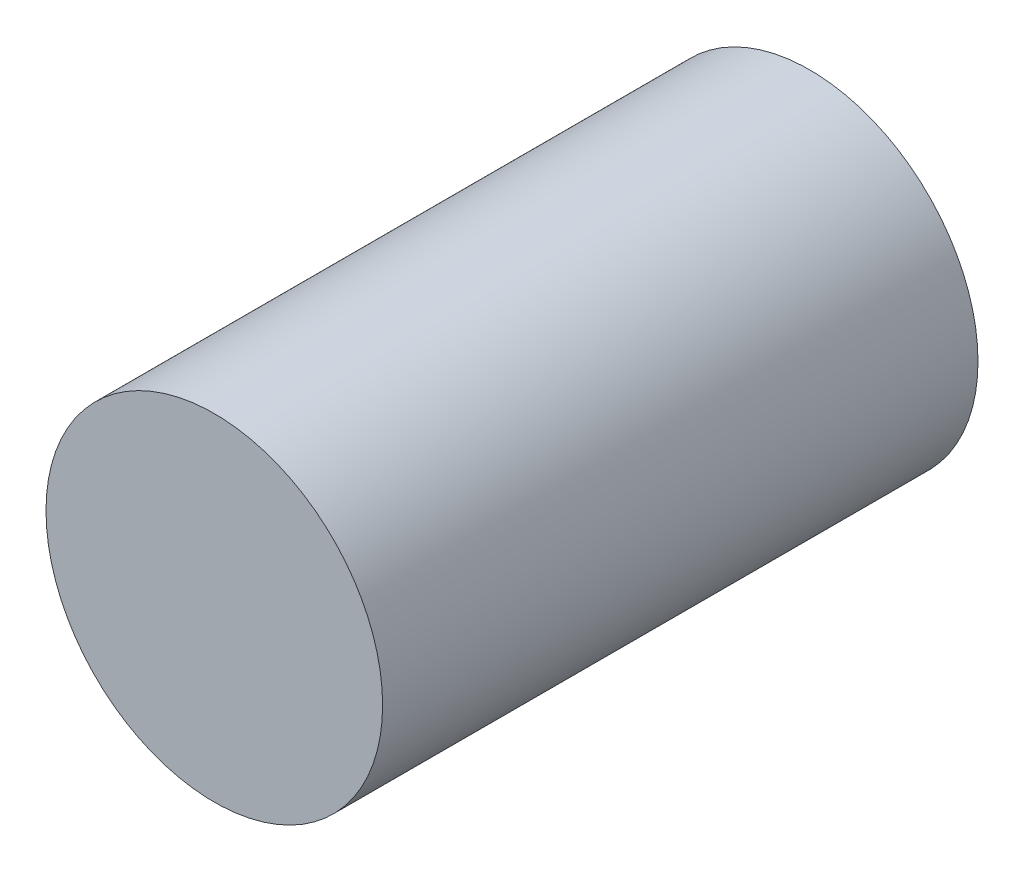
ISO-10303-21;
HEADER;
FILE_DESCRIPTION(('STEP AP214'),'2;1');
FILE_NAME('part.step','',(''),(''),'','','');
FILE_SCHEMA(('AUTOMOTIVE_DESIGN { 1 0 10303 214 1 1 1 1 }'));
ENDSEC;
DATA;
#1=APPLICATION_CONTEXT('core data for automotive mechanical design processes');
#2=APPLICATION_PROTOCOL_DEFINITION('international standard','automotive_design',2000,#1);
#3=PRODUCT_CONTEXT('',#1,'mechanical');
#4=PRODUCT('Part','Part','',(#3));
#5=PRODUCT_RELATED_PRODUCT_CATEGORY('part','',(#4));
#6=PRODUCT_DEFINITION_FORMATION('','',#4);
#7=PRODUCT_DEFINITION_CONTEXT('part definition',#1,'design');
#8=PRODUCT_DEFINITION('design','',#6,#7);
#9=PRODUCT_DEFINITION_SHAPE('','',#8);
#10=(LENGTH_UNIT() NAMED_UNIT(*) SI_UNIT(.MILLI.,.METRE.));
#11=(NAMED_UNIT(*) PLANE_ANGLE_UNIT() SI_UNIT($,.RADIAN.));
#12=(NAMED_UNIT(*) SI_UNIT($,.STERADIAN.) SOLID_ANGLE_UNIT());
#13=UNCERTAINTY_MEASURE_WITH_UNIT(LENGTH_MEASURE(1.E-05),#10,'distance_accuracy_value','');
#14=(GEOMETRIC_REPRESENTATION_CONTEXT(3) GLOBAL_UNCERTAINTY_ASSIGNED_CONTEXT((#13)) GLOBAL_UNIT_ASSIGNED_CONTEXT((#10,
#11,#12)) REPRESENTATION_CONTEXT('',''));
#15=CARTESIAN_POINT('',(0.,0.,0.));
#16=DIRECTION('',(0.,0.,1.));
#17=DIRECTION('',(1.,0.,0.));
#18=AXIS2_PLACEMENT_3D('',#15,#16,#17);
#19=CARTESIAN_POINT('',(0.,0.,116.74));
#20=DIRECTION('',(0.,0.,-1.));
#21=DIRECTION('',(-1.,0.,0.));
#22=AXIS2_PLACEMENT_3D('',#19,#20,#21);
#23=CYLINDRICAL_SURFACE('',#22,33.);
#24=CARTESIAN_POINT('',(0.,0.,116.74));
#25=DIRECTION('',(0.,0.,1.));
#26=DIRECTION('',(1.,0.,0.));
#27=AXIS2_PLACEMENT_3D('',#24,#25,#26);
#28=CIRCLE('',#27,33.);
#29=CARTESIAN_POINT('',(-33.,0.,116.74));
#30=VERTEX_POINT('',#29);
#31=EDGE_CURVE('E10',#30,#30,#28,.T.);
#32=CARTESIAN_POINT('',(0.,0.,0.));
#33=DIRECTION('',(0.,0.,1.));
#34=DIRECTION('',(1.,0.,0.));
#35=AXIS2_PLACEMENT_3D('',#32,#33,#34);
#36=CIRCLE('',#35,33.);
#37=CARTESIAN_POINT('',(-33.,0.,0.));
#38=VERTEX_POINT('',#37);
#39=EDGE_CURVE('E37',#38,#38,#36,.T.);
#40=CARTESIAN_POINT('',(-33.,0.,116.74));
#41=CARTESIAN_POINT('',(-33.,0.,115.523958333333));
#42=CARTESIAN_POINT('',(-33.,0.,114.307916666667));
#43=CARTESIAN_POINT('',(-33.,0.,111.875833333333));
#44=CARTESIAN_POINT('',(-33.,0.,110.659791666667));
#45=CARTESIAN_POINT('',(-33.,0.,108.227708333333));
#46=CARTESIAN_POINT('',(-33.,0.,107.011666666667));
#47=CARTESIAN_POINT('',(-33.,0.,104.579583333333));
#48=CARTESIAN_POINT('',(-33.,0.,103.363541666667));
#49=CARTESIAN_POINT('',(-33.,0.,100.931458333333));
#50=CARTESIAN_POINT('',(-33.,0.,99.7154166666667));
#51=CARTESIAN_POINT('',(-33.,0.,97.2833333333333));
#52=CARTESIAN_POINT('',(-33.,0.,96.0672916666667));
#53=CARTESIAN_POINT('',(-33.,0.,93.6352083333333));
#54=CARTESIAN_POINT('',(-33.,0.,92.4191666666667));
#55=CARTESIAN_POINT('',(-33.,0.,89.9870833333333));
#56=CARTESIAN_POINT('',(-33.,0.,88.7710416666667));
#57=CARTESIAN_POINT('',(-33.,0.,86.3389583333333));
#58=CARTESIAN_POINT('',(-33.,0.,85.1229166666667));
#59=CARTESIAN_POINT('',(-33.,0.,82.6908333333333));
#60=CARTESIAN_POINT('',(-33.,0.,81.4747916666667));
#61=CARTESIAN_POINT('',(-33.,0.,79.0427083333333));
#62=CARTESIAN_POINT('',(-33.,0.,77.8266666666667));
#63=CARTESIAN_POINT('',(-33.,0.,75.3945833333333));
#64=CARTESIAN_POINT('',(-33.,0.,74.1785416666667));
#65=CARTESIAN_POINT('',(-33.,0.,71.7464583333333));
#66=CARTESIAN_POINT('',(-33.,0.,70.5304166666667));
#67=CARTESIAN_POINT('',(-33.,0.,68.0983333333333));
#68=CARTESIAN_POINT('',(-33.,0.,66.8822916666667));
#69=CARTESIAN_POINT('',(-33.,0.,64.4502083333333));
#70=CARTESIAN_POINT('',(-33.,0.,63.2341666666667));
#71=CARTESIAN_POINT('',(-33.,0.,60.8020833333333));
#72=CARTESIAN_POINT('',(-33.,0.,59.5860416666667));
#73=CARTESIAN_POINT('',(-33.,0.,57.1539583333333));
#74=CARTESIAN_POINT('',(-33.,0.,55.9379166666667));
#75=CARTESIAN_POINT('',(-33.,0.,53.5058333333333));
#76=CARTESIAN_POINT('',(-33.,0.,52.2897916666667));
#77=CARTESIAN_POINT('',(-33.,0.,49.8577083333333));
#78=CARTESIAN_POINT('',(-33.,0.,48.6416666666667));
#79=CARTESIAN_POINT('',(-33.,0.,46.2095833333333));
#80=CARTESIAN_POINT('',(-33.,0.,44.9935416666667));
#81=CARTESIAN_POINT('',(-33.,0.,42.5614583333333));
#82=CARTESIAN_POINT('',(-33.,0.,41.3454166666667));
#83=CARTESIAN_POINT('',(-33.,0.,38.9133333333333));
#84=CARTESIAN_POINT('',(-33.,0.,37.6972916666667));
#85=CARTESIAN_POINT('',(-33.,0.,35.2652083333333));
#86=CARTESIAN_POINT('',(-33.,0.,34.0491666666667));
#87=CARTESIAN_POINT('',(-33.,0.,31.6170833333333));
#88=CARTESIAN_POINT('',(-33.,0.,30.4010416666667));
#89=CARTESIAN_POINT('',(-33.,0.,27.9689583333333));
#90=CARTESIAN_POINT('',(-33.,0.,26.7529166666667));
#91=CARTESIAN_POINT('',(-33.,0.,24.3208333333333));
#92=CARTESIAN_POINT('',(-33.,0.,23.1047916666667));
#93=CARTESIAN_POINT('',(-33.,0.,20.6727083333333));
#94=CARTESIAN_POINT('',(-33.,0.,19.4566666666667));
#95=CARTESIAN_POINT('',(-33.,0.,17.0245833333333));
#96=CARTESIAN_POINT('',(-33.,0.,15.8085416666667));
#97=CARTESIAN_POINT('',(-33.,0.,13.3764583333333));
#98=CARTESIAN_POINT('',(-33.,0.,12.1604166666667));
#99=CARTESIAN_POINT('',(-33.,0.,9.72833333333334));
#100=CARTESIAN_POINT('',(-33.,0.,8.51229166666667));
#101=CARTESIAN_POINT('',(-33.,0.,6.08020833333334));
#102=CARTESIAN_POINT('',(-33.,0.,4.86416666666667));
#103=CARTESIAN_POINT('',(-33.,0.,2.43208333333333));
#104=CARTESIAN_POINT('',(-33.,0.,1.21604166666667));
#105=CARTESIAN_POINT('',(-33.,0.,0.));
#106=B_SPLINE_CURVE_WITH_KNOTS('',3,(#40,#41,#42,#43,#44,#45,#46,#47,#48,#49,#50,#51,#52,#53,
#54,#55,#56,#57,#58,#59,#60,#61,#62,#63,#64,#65,#66,#67,#68,#69,#70,#71,#72,#73,#74,#75,#76,#77,
#78,#79,#80,#81,#82,#83,#84,#85,#86,#87,#88,#89,#90,#91,#92,#93,#94,#95,#96,#97,#98,#99,#100,
#101,#102,#103,#104,#105),.UNSPECIFIED.,.F.,.F.,(4,2,2,2,2,2,2,2,2,2,2,2,2,2,2,2,2,2,2,2,2,2,2,
2,2,2,2,2,2,2,2,2,4),(0.,3.64812499999999,7.29624999999999,10.944375,14.5925,18.240625,21.88875,
25.536875,29.185,32.833125,36.48125,40.129375,43.7775,47.425625,51.07375,54.721875,58.37,
62.018125,65.66625,69.314375,72.9625,76.610625,80.25875,83.906875,87.555,91.203125,94.85125,
98.499375,102.1475,105.795625,109.44375,113.091875,116.74),.UNSPECIFIED.);
#107=EDGE_CURVE('BSEAM34',#30,#38,#106,.T.);
#108=ORIENTED_EDGE('',*,*,#31,.F.);
#109=ORIENTED_EDGE('',*,*,#39,.T.);
#110=ORIENTED_EDGE('',*,*,#107,.T.);
#111=ORIENTED_EDGE('',*,*,#107,.F.);
#112=EDGE_LOOP('',(#108,#110,#109,#111));
#113=FACE_BOUND('',#112,.T.);
#114=ADVANCED_FACE('F34',(#113),#23,.T.);
#115=CARTESIAN_POINT('',(0.,0.,116.74));
#116=DIRECTION('',(0.,0.,1.));
#117=DIRECTION('',(1.,0.,0.));
#118=AXIS2_PLACEMENT_3D('',#115,#116,#117);
#119=PLANE('',#118);
#120=ORIENTED_EDGE('',*,*,#31,.T.);
#121=EDGE_LOOP('',(#120));
#122=FACE_BOUND('',#121,.T.);
#123=ADVANCED_FACE('F49',(#122),#119,.T.);
#124=CARTESIAN_POINT('',(0.,0.,0.));
#125=DIRECTION('',(0.,0.,1.));
#126=DIRECTION('',(1.,0.,0.));
#127=AXIS2_PLACEMENT_3D('',#124,#125,#126);
#128=PLANE('',#127);
#129=ORIENTED_EDGE('',*,*,#39,.F.);
#130=EDGE_LOOP('',(#129));
#131=FACE_BOUND('',#130,.T.);
#132=ADVANCED_FACE('F47',(#131),#128,.F.);
#133=CLOSED_SHELL('',(#114,#123,#132));
#134=MANIFOLD_SOLID_BREP('B2',#133);
#135=ADVANCED_BREP_SHAPE_REPRESENTATION('',(#18,#134),#14);
#136=SHAPE_DEFINITION_REPRESENTATION(#9,#135);
ENDSEC;
END-ISO-10303-21;
